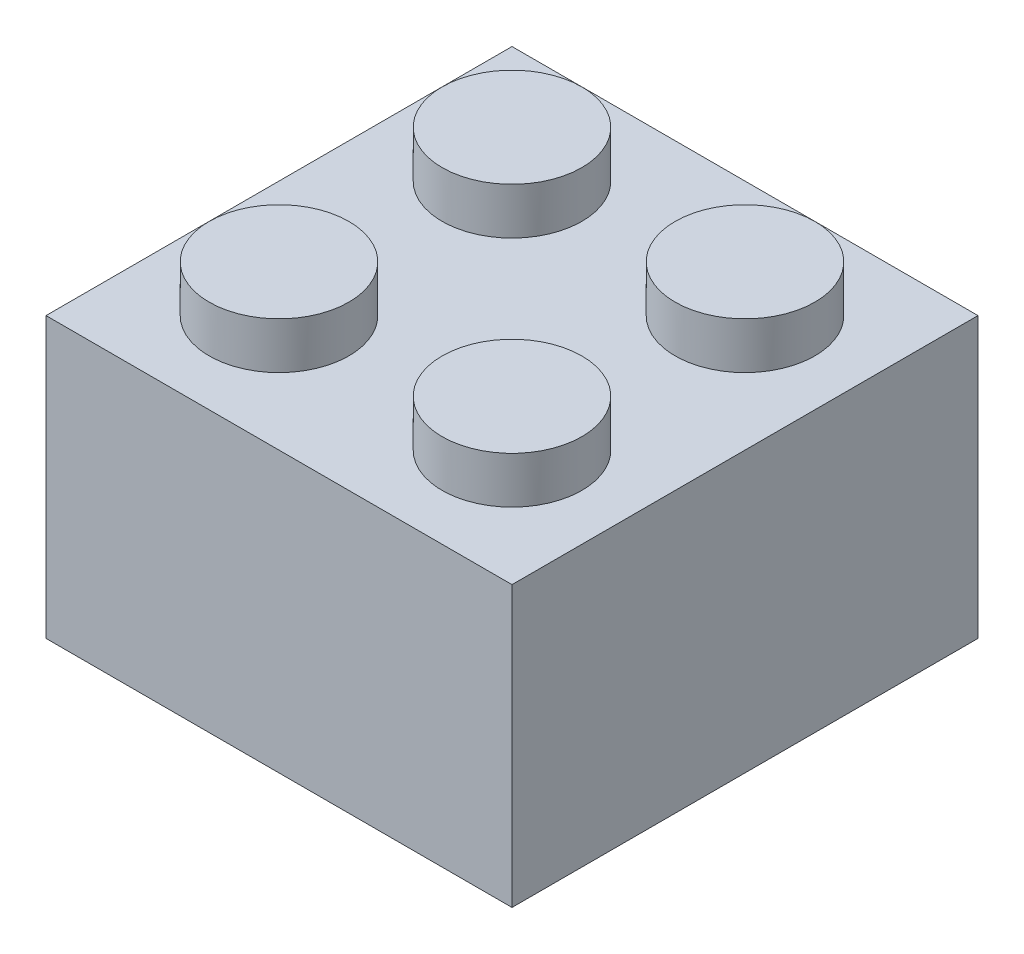
ISO-10303-21;
HEADER;
FILE_DESCRIPTION(('STEP AP214'),'2;1');
FILE_NAME('part.step','',(''),(''),'','','');
FILE_SCHEMA(('AUTOMOTIVE_DESIGN { 1 0 10303 214 1 1 1 1 }'));
ENDSEC;
DATA;
#1=APPLICATION_CONTEXT('core data for automotive mechanical design processes');
#2=APPLICATION_PROTOCOL_DEFINITION('international standard','automotive_design',2000,#1);
#3=PRODUCT_CONTEXT('',#1,'mechanical');
#4=PRODUCT('Part','Part','',(#3));
#5=PRODUCT_RELATED_PRODUCT_CATEGORY('part','',(#4));
#6=PRODUCT_DEFINITION_FORMATION('','',#4);
#7=PRODUCT_DEFINITION_CONTEXT('part definition',#1,'design');
#8=PRODUCT_DEFINITION('design','',#6,#7);
#9=PRODUCT_DEFINITION_SHAPE('','',#8);
#10=(LENGTH_UNIT() NAMED_UNIT(*) SI_UNIT(.MILLI.,.METRE.));
#11=(NAMED_UNIT(*) PLANE_ANGLE_UNIT() SI_UNIT($,.RADIAN.));
#12=(NAMED_UNIT(*) SI_UNIT($,.STERADIAN.) SOLID_ANGLE_UNIT());
#13=UNCERTAINTY_MEASURE_WITH_UNIT(LENGTH_MEASURE(1.E-05),#10,'distance_accuracy_value','');
#14=(GEOMETRIC_REPRESENTATION_CONTEXT(3) GLOBAL_UNCERTAINTY_ASSIGNED_CONTEXT((#13)) GLOBAL_UNIT_ASSIGNED_CONTEXT((#10,
#11,#12)) REPRESENTATION_CONTEXT('',''));
#15=CARTESIAN_POINT('',(0.,0.,0.));
#16=DIRECTION('',(0.,0.,1.));
#17=DIRECTION('',(1.,0.,0.));
#18=AXIS2_PLACEMENT_3D('',#15,#16,#17);
#19=CARTESIAN_POINT('',(0.,0.,0.));
#20=DIRECTION('',(0.,-1.,0.));
#21=DIRECTION('',(0.,0.,-1.));
#22=AXIS2_PLACEMENT_3D('',#19,#20,#21);
#23=PLANE('',#22);
#24=DIRECTION('',(0.,0.,1.));
#25=VECTOR('',#24,1.);
#26=CARTESIAN_POINT('',(0.,0.,0.));
#27=LINE('',#26,#25);
#28=CARTESIAN_POINT('',(0.,0.,-16.));
#29=VERTEX_POINT('',#28);
#30=CARTESIAN_POINT('',(0.,0.,0.));
#31=VERTEX_POINT('',#30);
#32=EDGE_CURVE('E192',#29,#31,#27,.T.);
#33=ORIENTED_EDGE('',*,*,#32,.F.);
#34=DIRECTION('',(-1.,0.,0.));
#35=VECTOR('',#34,1.);
#36=CARTESIAN_POINT('',(0.,0.,-16.));
#37=LINE('',#36,#35);
#38=CARTESIAN_POINT('',(16.,0.,-16.));
#39=VERTEX_POINT('',#38);
#40=EDGE_CURVE('E85',#39,#29,#37,.T.);
#41=ORIENTED_EDGE('',*,*,#40,.F.);
#42=DIRECTION('',(0.,0.,-1.));
#43=VECTOR('',#42,1.);
#44=CARTESIAN_POINT('',(16.,0.,0.));
#45=LINE('',#44,#43);
#46=CARTESIAN_POINT('',(16.,0.,0.));
#47=VERTEX_POINT('',#46);
#48=EDGE_CURVE('E210',#47,#39,#45,.T.);
#49=ORIENTED_EDGE('',*,*,#48,.F.);
#50=DIRECTION('',(1.,0.,0.));
#51=VECTOR('',#50,1.);
#52=CARTESIAN_POINT('',(0.,0.,0.));
#53=LINE('',#52,#51);
#54=EDGE_CURVE('E207',#31,#47,#53,.T.);
#55=ORIENTED_EDGE('',*,*,#54,.F.);
#56=EDGE_LOOP('',(#33,#41,#49,#55));
#57=FACE_BOUND('',#56,.T.);
#58=DIRECTION('',(-1.,0.,0.));
#59=VECTOR('',#58,1.);
#60=CARTESIAN_POINT('',(0.,0.,-14.4));
#61=LINE('',#60,#59);
#62=CARTESIAN_POINT('',(14.4,0.,-14.4));
#63=VERTEX_POINT('',#62);
#64=CARTESIAN_POINT('',(1.6,0.,-14.4));
#65=VERTEX_POINT('',#64);
#66=EDGE_CURVE('E175',#63,#65,#61,.T.);
#67=ORIENTED_EDGE('',*,*,#66,.T.);
#68=DIRECTION('',(0.,0.,1.));
#69=VECTOR('',#68,1.);
#70=CARTESIAN_POINT('',(1.6,0.,0.));
#71=LINE('',#70,#69);
#72=CARTESIAN_POINT('',(1.6,0.,-1.6));
#73=VERTEX_POINT('',#72);
#74=EDGE_CURVE('E166',#65,#73,#71,.T.);
#75=ORIENTED_EDGE('',*,*,#74,.T.);
#76=DIRECTION('',(1.,0.,0.));
#77=VECTOR('',#76,1.);
#78=CARTESIAN_POINT('',(0.,0.,-1.6));
#79=LINE('',#78,#77);
#80=CARTESIAN_POINT('',(14.4,0.,-1.6));
#81=VERTEX_POINT('',#80);
#82=EDGE_CURVE('E174',#73,#81,#79,.T.);
#83=ORIENTED_EDGE('',*,*,#82,.T.);
#84=DIRECTION('',(0.,0.,-1.));
#85=VECTOR('',#84,1.);
#86=CARTESIAN_POINT('',(14.4,0.,0.));
#87=LINE('',#86,#85);
#88=EDGE_CURVE('E55',#81,#63,#87,.T.);
#89=ORIENTED_EDGE('',*,*,#88,.T.);
#90=EDGE_LOOP('',(#67,#75,#83,#89));
#91=FACE_BOUND('',#90,.T.);
#92=ADVANCED_FACE('F39',(#57,#91),#23,.T.);
#93=CARTESIAN_POINT('',(4.,11.2,-12.));
#94=DIRECTION('',(0.,1.,0.));
#95=DIRECTION('',(0.,0.,1.));
#96=AXIS2_PLACEMENT_3D('',#93,#94,#95);
#97=PLANE('',#96);
#98=CARTESIAN_POINT('',(4.,11.2,-12.));
#99=DIRECTION('',(0.,1.,0.));
#100=DIRECTION('',(0.,0.,1.));
#101=AXIS2_PLACEMENT_3D('',#98,#99,#100);
#102=CIRCLE('',#101,2.4);
#103=CARTESIAN_POINT('',(4.,11.2,-9.6));
#104=VERTEX_POINT('',#103);
#105=EDGE_CURVE('E11',#104,#104,#102,.T.);
#106=ORIENTED_EDGE('',*,*,#105,.T.);
#107=EDGE_LOOP('',(#106));
#108=FACE_BOUND('',#107,.T.);
#109=ADVANCED_FACE('F41',(#108),#97,.T.);
#110=CARTESIAN_POINT('',(4.,11.2,-12.));
#111=DIRECTION('',(0.,-1.,0.));
#112=DIRECTION('',(0.,0.,-1.));
#113=AXIS2_PLACEMENT_3D('',#110,#111,#112);
#114=CYLINDRICAL_SURFACE('',#113,2.4);
#115=ORIENTED_EDGE('',*,*,#105,.F.);
#116=EDGE_LOOP('',(#115));
#117=FACE_BOUND('',#116,.T.);
#118=CARTESIAN_POINT('',(4.,9.6,-12.));
#119=DIRECTION('',(0.,-1.,0.));
#120=DIRECTION('',(0.,0.,-1.));
#121=AXIS2_PLACEMENT_3D('',#118,#119,#120);
#122=CIRCLE('',#121,2.4);
#123=CARTESIAN_POINT('',(4.,9.6,-14.4));
#124=VERTEX_POINT('',#123);
#125=EDGE_CURVE('E48',#124,#124,#122,.F.);
#126=ORIENTED_EDGE('',*,*,#125,.T.);
#127=EDGE_LOOP('',(#126));
#128=FACE_BOUND('',#127,.T.);
#129=ADVANCED_FACE('F246',(#117,#128),#114,.T.);
#130=CARTESIAN_POINT('',(12.,11.2,-12.));
#131=DIRECTION('',(0.,1.,0.));
#132=DIRECTION('',(0.,0.,1.));
#133=AXIS2_PLACEMENT_3D('',#130,#131,#132);
#134=PLANE('',#133);
#135=CARTESIAN_POINT('',(12.,11.2,-12.));
#136=DIRECTION('',(0.,1.,0.));
#137=DIRECTION('',(0.,0.,1.));
#138=AXIS2_PLACEMENT_3D('',#135,#136,#137);
#139=CIRCLE('',#138,2.4);
#140=CARTESIAN_POINT('',(12.,11.2,-9.6));
#141=VERTEX_POINT('',#140);
#142=EDGE_CURVE('E239',#141,#141,#139,.T.);
#143=ORIENTED_EDGE('',*,*,#142,.T.);
#144=EDGE_LOOP('',(#143));
#145=FACE_BOUND('',#144,.T.);
#146=ADVANCED_FACE('F288',(#145),#134,.T.);
#147=CARTESIAN_POINT('',(12.,11.2,-12.));
#148=DIRECTION('',(0.,-1.,0.));
#149=DIRECTION('',(0.,0.,-1.));
#150=AXIS2_PLACEMENT_3D('',#147,#148,#149);
#151=CYLINDRICAL_SURFACE('',#150,2.4);
#152=ORIENTED_EDGE('',*,*,#142,.F.);
#153=EDGE_LOOP('',(#152));
#154=FACE_BOUND('',#153,.T.);
#155=CARTESIAN_POINT('',(12.,9.6,-12.));
#156=DIRECTION('',(0.,-1.,0.));
#157=DIRECTION('',(0.,0.,-1.));
#158=AXIS2_PLACEMENT_3D('',#155,#156,#157);
#159=CIRCLE('',#158,2.4);
#160=CARTESIAN_POINT('',(12.,9.6,-14.4));
#161=VERTEX_POINT('',#160);
#162=EDGE_CURVE('E235',#161,#161,#159,.F.);
#163=ORIENTED_EDGE('',*,*,#162,.T.);
#164=EDGE_LOOP('',(#163));
#165=FACE_BOUND('',#164,.T.);
#166=ADVANCED_FACE('F284',(#154,#165),#151,.T.);
#167=CARTESIAN_POINT('',(0.,9.6,0.));
#168=DIRECTION('',(1.,0.,0.));
#169=DIRECTION('',(0.,0.,-1.));
#170=AXIS2_PLACEMENT_3D('',#167,#168,#169);
#171=PLANE('',#170);
#172=ORIENTED_EDGE('',*,*,#32,.T.);
#173=DIRECTION('',(0.,-1.,0.));
#174=VECTOR('',#173,1.);
#175=CARTESIAN_POINT('',(0.,9.6,0.));
#176=LINE('',#175,#174);
#177=CARTESIAN_POINT('',(0.,9.6,0.));
#178=VERTEX_POINT('',#177);
#179=EDGE_CURVE('E224',#178,#31,#176,.T.);
#180=ORIENTED_EDGE('',*,*,#179,.F.);
#181=DIRECTION('',(0.,0.,1.));
#182=VECTOR('',#181,1.);
#183=CARTESIAN_POINT('',(0.,9.6,0.));
#184=LINE('',#183,#182);
#185=CARTESIAN_POINT('',(0.,9.6,-16.));
#186=VERTEX_POINT('',#185);
#187=EDGE_CURVE('E193',#186,#178,#184,.T.);
#188=ORIENTED_EDGE('',*,*,#187,.F.);
#189=DIRECTION('',(0.,-1.,0.));
#190=VECTOR('',#189,1.);
#191=CARTESIAN_POINT('',(0.,9.6,-16.));
#192=LINE('',#191,#190);
#193=EDGE_CURVE('E203',#186,#29,#192,.T.);
#194=ORIENTED_EDGE('',*,*,#193,.T.);
#195=EDGE_LOOP('',(#172,#180,#188,#194));
#196=FACE_BOUND('',#195,.T.);
#197=ADVANCED_FACE('F281',(#196),#171,.F.);
#198=CARTESIAN_POINT('',(0.,9.6,0.));
#199=DIRECTION('',(0.,0.,-1.));
#200=DIRECTION('',(-1.,0.,0.));
#201=AXIS2_PLACEMENT_3D('',#198,#199,#200);
#202=PLANE('',#201);
#203=ORIENTED_EDGE('',*,*,#54,.T.);
#204=DIRECTION('',(0.,-1.,0.));
#205=VECTOR('',#204,1.);
#206=CARTESIAN_POINT('',(16.,9.6,0.));
#207=LINE('',#206,#205);
#208=CARTESIAN_POINT('',(16.,9.6,0.));
#209=VERTEX_POINT('',#208);
#210=EDGE_CURVE('E220',#209,#47,#207,.T.);
#211=ORIENTED_EDGE('',*,*,#210,.F.);
#212=DIRECTION('',(1.,0.,0.));
#213=VECTOR('',#212,1.);
#214=CARTESIAN_POINT('',(0.,9.6,0.));
#215=LINE('',#214,#213);
#216=EDGE_CURVE('E93',#178,#209,#215,.T.);
#217=ORIENTED_EDGE('',*,*,#216,.F.);
#218=ORIENTED_EDGE('',*,*,#179,.T.);
#219=EDGE_LOOP('',(#203,#211,#217,#218));
#220=FACE_BOUND('',#219,.T.);
#221=ADVANCED_FACE('F277',(#220),#202,.F.);
#222=CARTESIAN_POINT('',(16.,9.6,0.));
#223=DIRECTION('',(-1.,0.,0.));
#224=DIRECTION('',(0.,0.,1.));
#225=AXIS2_PLACEMENT_3D('',#222,#223,#224);
#226=PLANE('',#225);
#227=ORIENTED_EDGE('',*,*,#48,.T.);
#228=DIRECTION('',(0.,-1.,0.));
#229=VECTOR('',#228,1.);
#230=CARTESIAN_POINT('',(16.,9.6,-16.));
#231=LINE('',#230,#229);
#232=CARTESIAN_POINT('',(16.,9.6,-16.));
#233=VERTEX_POINT('',#232);
#234=EDGE_CURVE('E217',#233,#39,#231,.T.);
#235=ORIENTED_EDGE('',*,*,#234,.F.);
#236=DIRECTION('',(0.,0.,-1.));
#237=VECTOR('',#236,1.);
#238=CARTESIAN_POINT('',(16.,9.6,0.));
#239=LINE('',#238,#237);
#240=EDGE_CURVE('E198',#209,#233,#239,.T.);
#241=ORIENTED_EDGE('',*,*,#240,.F.);
#242=ORIENTED_EDGE('',*,*,#210,.T.);
#243=EDGE_LOOP('',(#227,#235,#241,#242));
#244=FACE_BOUND('',#243,.T.);
#245=ADVANCED_FACE('F261',(#244),#226,.F.);
#246=CARTESIAN_POINT('',(0.,9.6,-16.));
#247=DIRECTION('',(0.,0.,1.));
#248=DIRECTION('',(1.,0.,0.));
#249=AXIS2_PLACEMENT_3D('',#246,#247,#248);
#250=PLANE('',#249);
#251=ORIENTED_EDGE('',*,*,#40,.T.);
#252=ORIENTED_EDGE('',*,*,#193,.F.);
#253=DIRECTION('',(-1.,0.,0.));
#254=VECTOR('',#253,1.);
#255=CARTESIAN_POINT('',(0.,9.6,-16.));
#256=LINE('',#255,#254);
#257=EDGE_CURVE('E64',#233,#186,#256,.T.);
#258=ORIENTED_EDGE('',*,*,#257,.F.);
#259=ORIENTED_EDGE('',*,*,#234,.T.);
#260=EDGE_LOOP('',(#251,#252,#258,#259));
#261=FACE_BOUND('',#260,.T.);
#262=ADVANCED_FACE('F251',(#261),#250,.F.);
#263=CARTESIAN_POINT('',(0.,9.6,0.));
#264=DIRECTION('',(0.,-1.,0.));
#265=DIRECTION('',(0.,0.,-1.));
#266=AXIS2_PLACEMENT_3D('',#263,#264,#265);
#267=PLANE('',#266);
#268=CARTESIAN_POINT('',(4.,9.6,-4.));
#269=DIRECTION('',(0.,-1.,0.));
#270=DIRECTION('',(0.,0.,-1.));
#271=AXIS2_PLACEMENT_3D('',#268,#269,#270);
#272=CIRCLE('',#271,2.4);
#273=CARTESIAN_POINT('',(4.,9.6,-6.4));
#274=VERTEX_POINT('',#273);
#275=EDGE_CURVE('E231',#274,#274,#272,.F.);
#276=ORIENTED_EDGE('',*,*,#275,.F.);
#277=EDGE_LOOP('',(#276));
#278=FACE_BOUND('',#277,.T.);
#279=CARTESIAN_POINT('',(12.,9.6,-4.));
#280=DIRECTION('',(0.,-1.,0.));
#281=DIRECTION('',(0.,0.,-1.));
#282=AXIS2_PLACEMENT_3D('',#279,#280,#281);
#283=CIRCLE('',#282,2.4);
#284=CARTESIAN_POINT('',(12.,9.6,-6.4));
#285=VERTEX_POINT('',#284);
#286=EDGE_CURVE('E227',#285,#285,#283,.F.);
#287=ORIENTED_EDGE('',*,*,#286,.F.);
#288=EDGE_LOOP('',(#287));
#289=FACE_BOUND('',#288,.T.);
#290=ORIENTED_EDGE('',*,*,#187,.T.);
#291=ORIENTED_EDGE('',*,*,#216,.T.);
#292=ORIENTED_EDGE('',*,*,#240,.T.);
#293=ORIENTED_EDGE('',*,*,#257,.T.);
#294=EDGE_LOOP('',(#290,#291,#292,#293));
#295=FACE_BOUND('',#294,.T.);
#296=ORIENTED_EDGE('',*,*,#162,.F.);
#297=EDGE_LOOP('',(#296));
#298=FACE_BOUND('',#297,.T.);
#299=ORIENTED_EDGE('',*,*,#125,.F.);
#300=EDGE_LOOP('',(#299));
#301=FACE_BOUND('',#300,.T.);
#302=ADVANCED_FACE('F248',(#278,#289,#295,#298,#301),#267,.F.);
#303=CARTESIAN_POINT('',(12.,11.2,-4.));
#304=DIRECTION('',(0.,-1.,0.));
#305=DIRECTION('',(0.,0.,-1.));
#306=AXIS2_PLACEMENT_3D('',#303,#304,#305);
#307=CYLINDRICAL_SURFACE('',#306,2.4);
#308=CARTESIAN_POINT('',(12.,11.2,-4.));
#309=DIRECTION('',(0.,1.,0.));
#310=DIRECTION('',(0.,0.,1.));
#311=AXIS2_PLACEMENT_3D('',#308,#309,#310);
#312=CIRCLE('',#311,2.4);
#313=CARTESIAN_POINT('',(12.,11.2,-1.6));
#314=VERTEX_POINT('',#313);
#315=EDGE_CURVE('E187',#314,#314,#312,.T.);
#316=ORIENTED_EDGE('',*,*,#315,.F.);
#317=EDGE_LOOP('',(#316));
#318=FACE_BOUND('',#317,.T.);
#319=ORIENTED_EDGE('',*,*,#286,.T.);
#320=EDGE_LOOP('',(#319));
#321=FACE_BOUND('',#320,.T.);
#322=ADVANCED_FACE('F250',(#318,#321),#307,.T.);
#323=CARTESIAN_POINT('',(12.,11.2,-4.));
#324=DIRECTION('',(0.,1.,0.));
#325=DIRECTION('',(0.,0.,1.));
#326=AXIS2_PLACEMENT_3D('',#323,#324,#325);
#327=PLANE('',#326);
#328=ORIENTED_EDGE('',*,*,#315,.T.);
#329=EDGE_LOOP('',(#328));
#330=FACE_BOUND('',#329,.T.);
#331=ADVANCED_FACE('F258',(#330),#327,.T.);
#332=CARTESIAN_POINT('',(4.,11.2,-4.));
#333=DIRECTION('',(0.,-1.,0.));
#334=DIRECTION('',(0.,0.,-1.));
#335=AXIS2_PLACEMENT_3D('',#332,#333,#334);
#336=CYLINDRICAL_SURFACE('',#335,2.4);
#337=CARTESIAN_POINT('',(4.,11.2,-4.));
#338=DIRECTION('',(0.,1.,0.));
#339=DIRECTION('',(0.,0.,1.));
#340=AXIS2_PLACEMENT_3D('',#337,#338,#339);
#341=CIRCLE('',#340,2.4);
#342=CARTESIAN_POINT('',(4.,11.2,-1.6));
#343=VERTEX_POINT('',#342);
#344=EDGE_CURVE('E183',#343,#343,#341,.T.);
#345=ORIENTED_EDGE('',*,*,#344,.F.);
#346=EDGE_LOOP('',(#345));
#347=FACE_BOUND('',#346,.T.);
#348=ORIENTED_EDGE('',*,*,#275,.T.);
#349=EDGE_LOOP('',(#348));
#350=FACE_BOUND('',#349,.T.);
#351=ADVANCED_FACE('F338',(#347,#350),#336,.T.);
#352=CARTESIAN_POINT('',(4.,11.2,-4.));
#353=DIRECTION('',(0.,1.,0.));
#354=DIRECTION('',(0.,0.,1.));
#355=AXIS2_PLACEMENT_3D('',#352,#353,#354);
#356=PLANE('',#355);
#357=ORIENTED_EDGE('',*,*,#344,.T.);
#358=EDGE_LOOP('',(#357));
#359=FACE_BOUND('',#358,.T.);
#360=ADVANCED_FACE('F360',(#359),#356,.T.);
#361=CARTESIAN_POINT('',(4.,9.6,-12.));
#362=DIRECTION('',(0.,1.,0.));
#363=DIRECTION('',(0.,0.,1.));
#364=AXIS2_PLACEMENT_3D('',#361,#362,#363);
#365=PLANE('',#364);
#366=CARTESIAN_POINT('',(4.,9.6,-12.));
#367=DIRECTION('',(0.,1.,0.));
#368=DIRECTION('',(0.,0.,1.));
#369=AXIS2_PLACEMENT_3D('',#366,#367,#368);
#370=CIRCLE('',#369,0.799999999999999);
#371=CARTESIAN_POINT('',(4.,9.6,-11.2));
#372=VERTEX_POINT('',#371);
#373=EDGE_CURVE('E188',#372,#372,#370,.T.);
#374=ORIENTED_EDGE('',*,*,#373,.F.);
#375=EDGE_LOOP('',(#374));
#376=FACE_BOUND('',#375,.T.);
#377=ADVANCED_FACE('F369',(#376),#365,.F.);
#378=CARTESIAN_POINT('',(4.,11.2,-12.));
#379=DIRECTION('',(0.,-1.,0.));
#380=DIRECTION('',(0.,0.,-1.));
#381=AXIS2_PLACEMENT_3D('',#378,#379,#380);
#382=CYLINDRICAL_SURFACE('',#381,0.799999999999999);
#383=ORIENTED_EDGE('',*,*,#373,.T.);
#384=EDGE_LOOP('',(#383));
#385=FACE_BOUND('',#384,.T.);
#386=CARTESIAN_POINT('',(4.,8.,-12.));
#387=DIRECTION('',(0.,-1.,0.));
#388=DIRECTION('',(0.,0.,-1.));
#389=AXIS2_PLACEMENT_3D('',#386,#387,#388);
#390=CIRCLE('',#389,0.799999999999999);
#391=CARTESIAN_POINT('',(4.,8.,-12.8));
#392=VERTEX_POINT('',#391);
#393=EDGE_CURVE('E154',#392,#392,#390,.F.);
#394=ORIENTED_EDGE('',*,*,#393,.F.);
#395=EDGE_LOOP('',(#394));
#396=FACE_BOUND('',#395,.T.);
#397=ADVANCED_FACE('F382',(#385,#396),#382,.F.);
#398=CARTESIAN_POINT('',(12.,9.6,-12.));
#399=DIRECTION('',(0.,1.,0.));
#400=DIRECTION('',(0.,0.,1.));
#401=AXIS2_PLACEMENT_3D('',#398,#399,#400);
#402=PLANE('',#401);
#403=CARTESIAN_POINT('',(12.,9.6,-12.));
#404=DIRECTION('',(0.,1.,0.));
#405=DIRECTION('',(0.,0.,1.));
#406=AXIS2_PLACEMENT_3D('',#403,#404,#405);
#407=CIRCLE('',#406,0.799999999999999);
#408=CARTESIAN_POINT('',(12.,9.6,-11.2));
#409=VERTEX_POINT('',#408);
#410=EDGE_CURVE('E149',#409,#409,#407,.T.);
#411=ORIENTED_EDGE('',*,*,#410,.F.);
#412=EDGE_LOOP('',(#411));
#413=FACE_BOUND('',#412,.T.);
#414=ADVANCED_FACE('F391',(#413),#402,.F.);
#415=CARTESIAN_POINT('',(12.,11.2,-12.));
#416=DIRECTION('',(0.,-1.,0.));
#417=DIRECTION('',(0.,0.,-1.));
#418=AXIS2_PLACEMENT_3D('',#415,#416,#417);
#419=CYLINDRICAL_SURFACE('',#418,0.799999999999999);
#420=ORIENTED_EDGE('',*,*,#410,.T.);
#421=EDGE_LOOP('',(#420));
#422=FACE_BOUND('',#421,.T.);
#423=CARTESIAN_POINT('',(12.,8.,-12.));
#424=DIRECTION('',(0.,-1.,0.));
#425=DIRECTION('',(0.,0.,-1.));
#426=AXIS2_PLACEMENT_3D('',#423,#424,#425);
#427=CIRCLE('',#426,0.799999999999999);
#428=CARTESIAN_POINT('',(12.,8.,-12.8));
#429=VERTEX_POINT('',#428);
#430=EDGE_CURVE('E145',#429,#429,#427,.F.);
#431=ORIENTED_EDGE('',*,*,#430,.F.);
#432=EDGE_LOOP('',(#431));
#433=FACE_BOUND('',#432,.T.);
#434=ADVANCED_FACE('F400',(#422,#433),#419,.F.);
#435=CARTESIAN_POINT('',(1.6,9.6,0.));
#436=DIRECTION('',(1.,0.,0.));
#437=DIRECTION('',(0.,0.,-1.));
#438=AXIS2_PLACEMENT_3D('',#435,#436,#437);
#439=PLANE('',#438);
#440=ORIENTED_EDGE('',*,*,#74,.F.);
#441=DIRECTION('',(0.,-1.,0.));
#442=VECTOR('',#441,1.);
#443=CARTESIAN_POINT('',(1.6,9.6,-14.4));
#444=LINE('',#443,#442);
#445=CARTESIAN_POINT('',(1.6,8.,-14.4));
#446=VERTEX_POINT('',#445);
#447=EDGE_CURVE('E141',#446,#65,#444,.T.);
#448=ORIENTED_EDGE('',*,*,#447,.F.);
#449=DIRECTION('',(0.,0.,1.));
#450=VECTOR('',#449,1.);
#451=CARTESIAN_POINT('',(1.6,8.,0.));
#452=LINE('',#451,#450);
#453=CARTESIAN_POINT('',(1.6,8.,-1.6));
#454=VERTEX_POINT('',#453);
#455=EDGE_CURVE('E127',#446,#454,#452,.T.);
#456=ORIENTED_EDGE('',*,*,#455,.T.);
#457=DIRECTION('',(0.,-1.,0.));
#458=VECTOR('',#457,1.);
#459=CARTESIAN_POINT('',(1.6,9.6,-1.6));
#460=LINE('',#459,#458);
#461=EDGE_CURVE('E120',#454,#73,#460,.T.);
#462=ORIENTED_EDGE('',*,*,#461,.T.);
#463=EDGE_LOOP('',(#440,#448,#456,#462));
#464=FACE_BOUND('',#463,.T.);
#465=ADVANCED_FACE('F409',(#464),#439,.T.);
#466=CARTESIAN_POINT('',(0.,9.6,-1.6));
#467=DIRECTION('',(0.,0.,-1.));
#468=DIRECTION('',(-1.,0.,0.));
#469=AXIS2_PLACEMENT_3D('',#466,#467,#468);
#470=PLANE('',#469);
#471=ORIENTED_EDGE('',*,*,#82,.F.);
#472=ORIENTED_EDGE('',*,*,#461,.F.);
#473=DIRECTION('',(1.,0.,0.));
#474=VECTOR('',#473,1.);
#475=CARTESIAN_POINT('',(0.,8.,-1.6));
#476=LINE('',#475,#474);
#477=CARTESIAN_POINT('',(14.4,8.,-1.6));
#478=VERTEX_POINT('',#477);
#479=EDGE_CURVE('E115',#454,#478,#476,.T.);
#480=ORIENTED_EDGE('',*,*,#479,.T.);
#481=DIRECTION('',(0.,-1.,0.));
#482=VECTOR('',#481,1.);
#483=CARTESIAN_POINT('',(14.4,9.6,-1.6));
#484=LINE('',#483,#482);
#485=EDGE_CURVE('E117',#478,#81,#484,.T.);
#486=ORIENTED_EDGE('',*,*,#485,.T.);
#487=EDGE_LOOP('',(#471,#472,#480,#486));
#488=FACE_BOUND('',#487,.T.);
#489=ADVANCED_FACE('F116',(#488),#470,.T.);
#490=CARTESIAN_POINT('',(14.4,9.6,0.));
#491=DIRECTION('',(-1.,0.,0.));
#492=DIRECTION('',(0.,0.,1.));
#493=AXIS2_PLACEMENT_3D('',#490,#491,#492);
#494=PLANE('',#493);
#495=ORIENTED_EDGE('',*,*,#88,.F.);
#496=ORIENTED_EDGE('',*,*,#485,.F.);
#497=DIRECTION('',(0.,0.,-1.));
#498=VECTOR('',#497,1.);
#499=CARTESIAN_POINT('',(14.4,8.,0.));
#500=LINE('',#499,#498);
#501=CARTESIAN_POINT('',(14.4,8.,-14.4));
#502=VERTEX_POINT('',#501);
#503=EDGE_CURVE('E126',#478,#502,#500,.T.);
#504=ORIENTED_EDGE('',*,*,#503,.T.);
#505=DIRECTION('',(0.,-1.,0.));
#506=VECTOR('',#505,1.);
#507=CARTESIAN_POINT('',(14.4,9.6,-14.4));
#508=LINE('',#507,#506);
#509=EDGE_CURVE('E132',#502,#63,#508,.T.);
#510=ORIENTED_EDGE('',*,*,#509,.T.);
#511=EDGE_LOOP('',(#495,#496,#504,#510));
#512=FACE_BOUND('',#511,.T.);
#513=ADVANCED_FACE('F129',(#512),#494,.T.);
#514=CARTESIAN_POINT('',(0.,9.6,-14.4));
#515=DIRECTION('',(0.,0.,1.));
#516=DIRECTION('',(1.,0.,0.));
#517=AXIS2_PLACEMENT_3D('',#514,#515,#516);
#518=PLANE('',#517);
#519=ORIENTED_EDGE('',*,*,#66,.F.);
#520=ORIENTED_EDGE('',*,*,#509,.F.);
#521=DIRECTION('',(-1.,0.,0.));
#522=VECTOR('',#521,1.);
#523=CARTESIAN_POINT('',(0.,8.,-14.4));
#524=LINE('',#523,#522);
#525=EDGE_CURVE('E137',#502,#446,#524,.T.);
#526=ORIENTED_EDGE('',*,*,#525,.T.);
#527=ORIENTED_EDGE('',*,*,#447,.T.);
#528=EDGE_LOOP('',(#519,#520,#526,#527));
#529=FACE_BOUND('',#528,.T.);
#530=ADVANCED_FACE('F433',(#529),#518,.T.);
#531=CARTESIAN_POINT('',(0.,8.,0.));
#532=DIRECTION('',(0.,-1.,0.));
#533=DIRECTION('',(0.,0.,-1.));
#534=AXIS2_PLACEMENT_3D('',#531,#532,#533);
#535=PLANE('',#534);
#536=CARTESIAN_POINT('',(4.,8.,-4.));
#537=DIRECTION('',(0.,-1.,0.));
#538=DIRECTION('',(0.,0.,-1.));
#539=AXIS2_PLACEMENT_3D('',#536,#537,#538);
#540=CIRCLE('',#539,0.799999999999999);
#541=CARTESIAN_POINT('',(4.,8.,-4.8));
#542=VERTEX_POINT('',#541);
#543=EDGE_CURVE('E150',#542,#542,#540,.F.);
#544=ORIENTED_EDGE('',*,*,#543,.T.);
#545=EDGE_LOOP('',(#544));
#546=FACE_BOUND('',#545,.T.);
#547=CARTESIAN_POINT('',(12.,8.,-4.));
#548=DIRECTION('',(0.,-1.,0.));
#549=DIRECTION('',(0.,0.,-1.));
#550=AXIS2_PLACEMENT_3D('',#547,#548,#549);
#551=CIRCLE('',#550,0.799999999999999);
#552=CARTESIAN_POINT('',(12.,8.,-4.8));
#553=VERTEX_POINT('',#552);
#554=EDGE_CURVE('E157',#553,#553,#551,.F.);
#555=ORIENTED_EDGE('',*,*,#554,.T.);
#556=EDGE_LOOP('',(#555));
#557=FACE_BOUND('',#556,.T.);
#558=ORIENTED_EDGE('',*,*,#455,.F.);
#559=ORIENTED_EDGE('',*,*,#525,.F.);
#560=ORIENTED_EDGE('',*,*,#503,.F.);
#561=ORIENTED_EDGE('',*,*,#479,.F.);
#562=EDGE_LOOP('',(#558,#559,#560,#561));
#563=FACE_BOUND('',#562,.T.);
#564=ORIENTED_EDGE('',*,*,#430,.T.);
#565=EDGE_LOOP('',(#564));
#566=FACE_BOUND('',#565,.T.);
#567=ORIENTED_EDGE('',*,*,#393,.T.);
#568=EDGE_LOOP('',(#567));
#569=FACE_BOUND('',#568,.T.);
#570=ADVANCED_FACE('F135',(#546,#557,#563,#566,#569),#535,.T.);
#571=CARTESIAN_POINT('',(12.,11.2,-4.));
#572=DIRECTION('',(0.,-1.,0.));
#573=DIRECTION('',(0.,0.,-1.));
#574=AXIS2_PLACEMENT_3D('',#571,#572,#573);
#575=CYLINDRICAL_SURFACE('',#574,0.799999999999999);
#576=CARTESIAN_POINT('',(12.,9.6,-4.));
#577=DIRECTION('',(0.,1.,0.));
#578=DIRECTION('',(0.,0.,1.));
#579=AXIS2_PLACEMENT_3D('',#576,#577,#578);
#580=CIRCLE('',#579,0.799999999999999);
#581=CARTESIAN_POINT('',(12.,9.6,-3.2));
#582=VERTEX_POINT('',#581);
#583=EDGE_CURVE('E162',#582,#582,#580,.T.);
#584=ORIENTED_EDGE('',*,*,#583,.T.);
#585=EDGE_LOOP('',(#584));
#586=FACE_BOUND('',#585,.T.);
#587=ORIENTED_EDGE('',*,*,#554,.F.);
#588=EDGE_LOOP('',(#587));
#589=FACE_BOUND('',#588,.T.);
#590=ADVANCED_FACE('F449',(#586,#589),#575,.F.);
#591=CARTESIAN_POINT('',(12.,9.6,-4.));
#592=DIRECTION('',(0.,1.,0.));
#593=DIRECTION('',(0.,0.,1.));
#594=AXIS2_PLACEMENT_3D('',#591,#592,#593);
#595=PLANE('',#594);
#596=ORIENTED_EDGE('',*,*,#583,.F.);
#597=EDGE_LOOP('',(#596));
#598=FACE_BOUND('',#597,.T.);
#599=ADVANCED_FACE('F458',(#598),#595,.F.);
#600=CARTESIAN_POINT('',(4.,11.2,-4.));
#601=DIRECTION('',(0.,-1.,0.));
#602=DIRECTION('',(0.,0.,-1.));
#603=AXIS2_PLACEMENT_3D('',#600,#601,#602);
#604=CYLINDRICAL_SURFACE('',#603,0.799999999999999);
#605=CARTESIAN_POINT('',(4.,9.6,-4.));
#606=DIRECTION('',(0.,1.,0.));
#607=DIRECTION('',(0.,0.,1.));
#608=AXIS2_PLACEMENT_3D('',#605,#606,#607);
#609=CIRCLE('',#608,0.799999999999999);
#610=CARTESIAN_POINT('',(4.,9.6,-3.2));
#611=VERTEX_POINT('',#610);
#612=EDGE_CURVE('E167',#611,#611,#609,.T.);
#613=ORIENTED_EDGE('',*,*,#612,.T.);
#614=EDGE_LOOP('',(#613));
#615=FACE_BOUND('',#614,.T.);
#616=ORIENTED_EDGE('',*,*,#543,.F.);
#617=EDGE_LOOP('',(#616));
#618=FACE_BOUND('',#617,.T.);
#619=ADVANCED_FACE('F467',(#615,#618),#604,.F.);
#620=CARTESIAN_POINT('',(4.,9.6,-4.));
#621=DIRECTION('',(0.,1.,0.));
#622=DIRECTION('',(0.,0.,1.));
#623=AXIS2_PLACEMENT_3D('',#620,#621,#622);
#624=PLANE('',#623);
#625=ORIENTED_EDGE('',*,*,#612,.F.);
#626=EDGE_LOOP('',(#625));
#627=FACE_BOUND('',#626,.T.);
#628=ADVANCED_FACE('F476',(#627),#624,.F.);
#629=CLOSED_SHELL('',(#92,#109,#129,#146,#166,#197,#221,#245,#262,#302,#322,#331,#351,#360,#377,
#397,#414,#434,#465,#489,#513,#530,#570,#590,#599,#619,#628));
#630=MANIFOLD_SOLID_BREP('B2',#629);
#631=ADVANCED_BREP_SHAPE_REPRESENTATION('',(#18,#630),#14);
#632=SHAPE_DEFINITION_REPRESENTATION(#9,#631);
ENDSEC;
END-ISO-10303-21;
